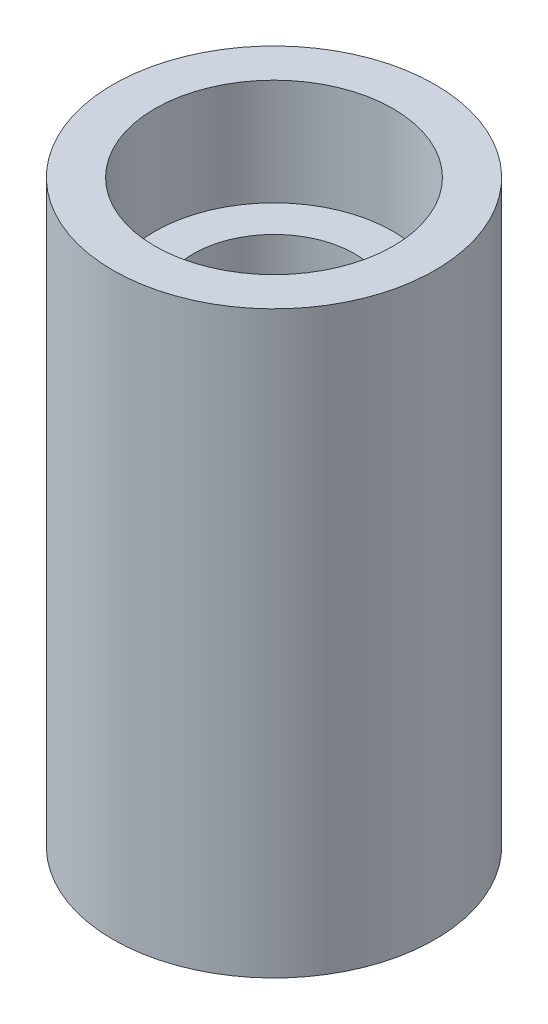
ISO-10303-21;
HEADER;
FILE_DESCRIPTION(('STEP AP214'),'2;1');
FILE_NAME('part.step','',(''),(''),'','','');
FILE_SCHEMA(('AUTOMOTIVE_DESIGN { 1 0 10303 214 1 1 1 1 }'));
ENDSEC;
DATA;
#1=APPLICATION_CONTEXT('core data for automotive mechanical design processes');
#2=APPLICATION_PROTOCOL_DEFINITION('international standard','automotive_design',2000,#1);
#3=PRODUCT_CONTEXT('',#1,'mechanical');
#4=PRODUCT('Part','Part','',(#3));
#5=PRODUCT_RELATED_PRODUCT_CATEGORY('part','',(#4));
#6=PRODUCT_DEFINITION_FORMATION('','',#4);
#7=PRODUCT_DEFINITION_CONTEXT('part definition',#1,'design');
#8=PRODUCT_DEFINITION('design','',#6,#7);
#9=PRODUCT_DEFINITION_SHAPE('','',#8);
#10=(LENGTH_UNIT() NAMED_UNIT(*) SI_UNIT(.MILLI.,.METRE.));
#11=(NAMED_UNIT(*) PLANE_ANGLE_UNIT() SI_UNIT($,.RADIAN.));
#12=(NAMED_UNIT(*) SI_UNIT($,.STERADIAN.) SOLID_ANGLE_UNIT());
#13=UNCERTAINTY_MEASURE_WITH_UNIT(LENGTH_MEASURE(1.E-05),#10,'distance_accuracy_value','');
#14=(GEOMETRIC_REPRESENTATION_CONTEXT(3) GLOBAL_UNCERTAINTY_ASSIGNED_CONTEXT((#13)) GLOBAL_UNIT_ASSIGNED_CONTEXT((#10,
#11,#12)) REPRESENTATION_CONTEXT('',''));
#15=CARTESIAN_POINT('',(0.,0.,0.));
#16=DIRECTION('',(0.,0.,1.));
#17=DIRECTION('',(1.,0.,0.));
#18=AXIS2_PLACEMENT_3D('',#15,#16,#17);
#19=CARTESIAN_POINT('',(0.,18.,0.));
#20=DIRECTION('',(0.,-1.,0.));
#21=DIRECTION('',(0.,0.,-1.));
#22=AXIS2_PLACEMENT_3D('',#19,#20,#21);
#23=CYLINDRICAL_SURFACE('',#22,2.5);
#24=CARTESIAN_POINT('',(0.,3.3,0.));
#25=DIRECTION('',(0.,-1.,0.));
#26=DIRECTION('',(0.,0.,-1.));
#27=AXIS2_PLACEMENT_3D('',#24,#25,#26);
#28=CIRCLE('',#27,2.5);
#29=CARTESIAN_POINT('',(0.,3.3,-2.5));
#30=VERTEX_POINT('',#29);
#31=EDGE_CURVE('E47',#30,#30,#28,.T.);
#32=ORIENTED_EDGE('',*,*,#31,.T.);
#33=EDGE_LOOP('',(#32));
#34=FACE_BOUND('',#33,.T.);
#35=CARTESIAN_POINT('',(0.,14.7,0.));
#36=DIRECTION('',(0.,1.,0.));
#37=DIRECTION('',(0.,0.,1.));
#38=AXIS2_PLACEMENT_3D('',#35,#36,#37);
#39=CIRCLE('',#38,2.5);
#40=CARTESIAN_POINT('',(0.,14.7,2.5));
#41=VERTEX_POINT('',#40);
#42=EDGE_CURVE('E56',#41,#41,#39,.T.);
#43=ORIENTED_EDGE('',*,*,#42,.T.);
#44=EDGE_LOOP('',(#43));
#45=FACE_BOUND('',#44,.T.);
#46=ADVANCED_FACE('F31',(#34,#45),#23,.F.);
#47=CARTESIAN_POINT('',(0.,18.,0.));
#48=DIRECTION('',(0.,1.,0.));
#49=DIRECTION('',(0.,0.,1.));
#50=AXIS2_PLACEMENT_3D('',#47,#48,#49);
#51=PLANE('',#50);
#52=CARTESIAN_POINT('',(0.,18.,0.));
#53=DIRECTION('',(0.,1.,0.));
#54=DIRECTION('',(0.,0.,1.));
#55=AXIS2_PLACEMENT_3D('',#52,#53,#54);
#56=CIRCLE('',#55,3.7);
#57=CARTESIAN_POINT('',(0.,18.,3.7));
#58=VERTEX_POINT('',#57);
#59=EDGE_CURVE('E53',#58,#58,#56,.T.);
#60=ORIENTED_EDGE('',*,*,#59,.F.);
#61=EDGE_LOOP('',(#60));
#62=FACE_BOUND('',#61,.T.);
#63=CARTESIAN_POINT('',(0.,18.,0.));
#64=DIRECTION('',(0.,1.,0.));
#65=DIRECTION('',(0.,0.,1.));
#66=AXIS2_PLACEMENT_3D('',#63,#64,#65);
#67=CIRCLE('',#66,5.);
#68=CARTESIAN_POINT('',(0.,18.,5.));
#69=VERTEX_POINT('',#68);
#70=EDGE_CURVE('E10',#69,#69,#67,.T.);
#71=ORIENTED_EDGE('',*,*,#70,.T.);
#72=EDGE_LOOP('',(#71));
#73=FACE_BOUND('',#72,.T.);
#74=ADVANCED_FACE('F76',(#62,#73),#51,.T.);
#75=CARTESIAN_POINT('',(0.,0.,0.));
#76=DIRECTION('',(0.,1.,0.));
#77=DIRECTION('',(0.,0.,1.));
#78=AXIS2_PLACEMENT_3D('',#75,#76,#77);
#79=PLANE('',#78);
#80=CARTESIAN_POINT('',(0.,0.,0.));
#81=DIRECTION('',(0.,-1.,0.));
#82=DIRECTION('',(0.,0.,-1.));
#83=AXIS2_PLACEMENT_3D('',#80,#81,#82);
#84=CIRCLE('',#83,3.7);
#85=CARTESIAN_POINT('',(0.,0.,-3.7));
#86=VERTEX_POINT('',#85);
#87=EDGE_CURVE('E44',#86,#86,#84,.T.);
#88=ORIENTED_EDGE('',*,*,#87,.F.);
#89=EDGE_LOOP('',(#88));
#90=FACE_BOUND('',#89,.T.);
#91=CARTESIAN_POINT('',(0.,0.,0.));
#92=DIRECTION('',(0.,1.,0.));
#93=DIRECTION('',(0.,0.,1.));
#94=AXIS2_PLACEMENT_3D('',#91,#92,#93);
#95=CIRCLE('',#94,5.);
#96=CARTESIAN_POINT('',(0.,0.,5.));
#97=VERTEX_POINT('',#96);
#98=EDGE_CURVE('E35',#97,#97,#95,.T.);
#99=ORIENTED_EDGE('',*,*,#98,.F.);
#100=EDGE_LOOP('',(#99));
#101=FACE_BOUND('',#100,.T.);
#102=ADVANCED_FACE('F78',(#90,#101),#79,.F.);
#103=CARTESIAN_POINT('',(0.,18.,0.));
#104=DIRECTION('',(0.,-1.,0.));
#105=DIRECTION('',(0.,0.,-1.));
#106=AXIS2_PLACEMENT_3D('',#103,#104,#105);
#107=CYLINDRICAL_SURFACE('',#106,5.);
#108=ORIENTED_EDGE('',*,*,#70,.F.);
#109=EDGE_LOOP('',(#108));
#110=FACE_BOUND('',#109,.T.);
#111=ORIENTED_EDGE('',*,*,#98,.T.);
#112=EDGE_LOOP('',(#111));
#113=FACE_BOUND('',#112,.T.);
#114=ADVANCED_FACE('F33',(#110,#113),#107,.T.);
#115=CARTESIAN_POINT('',(0.,3.3,0.));
#116=DIRECTION('',(0.,-1.,0.));
#117=DIRECTION('',(0.,0.,-1.));
#118=AXIS2_PLACEMENT_3D('',#115,#116,#117);
#119=CYLINDRICAL_SURFACE('',#118,3.7);
#120=CARTESIAN_POINT('',(0.,3.3,0.));
#121=DIRECTION('',(0.,-1.,0.));
#122=DIRECTION('',(0.,0.,-1.));
#123=AXIS2_PLACEMENT_3D('',#120,#121,#122);
#124=CIRCLE('',#123,3.7);
#125=CARTESIAN_POINT('',(0.,3.3,-3.7));
#126=VERTEX_POINT('',#125);
#127=EDGE_CURVE('E42',#126,#126,#124,.T.);
#128=ORIENTED_EDGE('',*,*,#127,.F.);
#129=EDGE_LOOP('',(#128));
#130=FACE_BOUND('',#129,.T.);
#131=ORIENTED_EDGE('',*,*,#87,.T.);
#132=EDGE_LOOP('',(#131));
#133=FACE_BOUND('',#132,.T.);
#134=ADVANCED_FACE('F89',(#130,#133),#119,.F.);
#135=CARTESIAN_POINT('',(0.,3.3,0.));
#136=DIRECTION('',(0.,-1.,0.));
#137=DIRECTION('',(0.,0.,-1.));
#138=AXIS2_PLACEMENT_3D('',#135,#136,#137);
#139=PLANE('',#138);
#140=ORIENTED_EDGE('',*,*,#31,.F.);
#141=EDGE_LOOP('',(#140));
#142=FACE_BOUND('',#141,.T.);
#143=ORIENTED_EDGE('',*,*,#127,.T.);
#144=EDGE_LOOP('',(#143));
#145=FACE_BOUND('',#144,.T.);
#146=ADVANCED_FACE('F72',(#142,#145),#139,.T.);
#147=CARTESIAN_POINT('',(0.,14.7,0.));
#148=DIRECTION('',(0.,1.,0.));
#149=DIRECTION('',(0.,0.,1.));
#150=AXIS2_PLACEMENT_3D('',#147,#148,#149);
#151=CYLINDRICAL_SURFACE('',#150,3.7);
#152=CARTESIAN_POINT('',(0.,14.7,0.));
#153=DIRECTION('',(0.,1.,0.));
#154=DIRECTION('',(0.,0.,1.));
#155=AXIS2_PLACEMENT_3D('',#152,#153,#154);
#156=CIRCLE('',#155,3.7);
#157=CARTESIAN_POINT('',(0.,14.7,3.7));
#158=VERTEX_POINT('',#157);
#159=EDGE_CURVE('E52',#158,#158,#156,.T.);
#160=ORIENTED_EDGE('',*,*,#159,.F.);
#161=EDGE_LOOP('',(#160));
#162=FACE_BOUND('',#161,.T.);
#163=ORIENTED_EDGE('',*,*,#59,.T.);
#164=EDGE_LOOP('',(#163));
#165=FACE_BOUND('',#164,.T.);
#166=ADVANCED_FACE('F66',(#162,#165),#151,.F.);
#167=CARTESIAN_POINT('',(0.,14.7,0.));
#168=DIRECTION('',(0.,1.,0.));
#169=DIRECTION('',(0.,0.,1.));
#170=AXIS2_PLACEMENT_3D('',#167,#168,#169);
#171=PLANE('',#170);
#172=ORIENTED_EDGE('',*,*,#42,.F.);
#173=EDGE_LOOP('',(#172));
#174=FACE_BOUND('',#173,.T.);
#175=ORIENTED_EDGE('',*,*,#159,.T.);
#176=EDGE_LOOP('',(#175));
#177=FACE_BOUND('',#176,.T.);
#178=ADVANCED_FACE('F63',(#174,#177),#171,.T.);
#179=CLOSED_SHELL('',(#46,#74,#102,#114,#134,#146,#166,#178));
#180=MANIFOLD_SOLID_BREP('B2',#179);
#181=ADVANCED_BREP_SHAPE_REPRESENTATION('',(#18,#180),#14);
#182=SHAPE_DEFINITION_REPRESENTATION(#9,#181);
ENDSEC;
END-ISO-10303-21;
